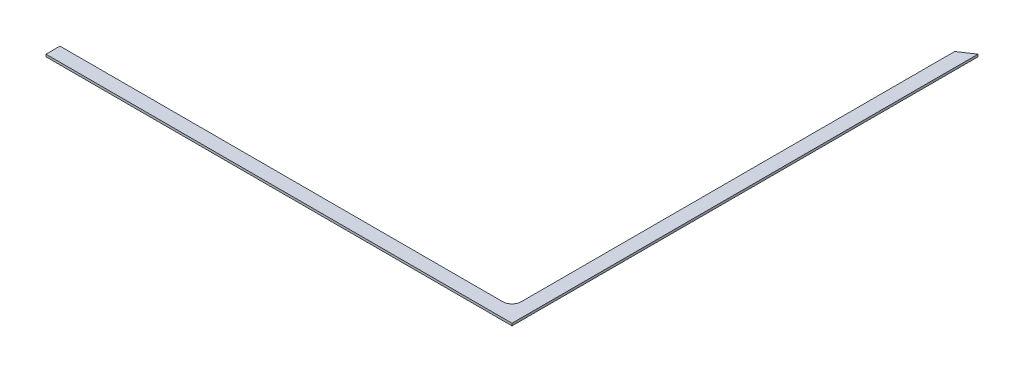
ISO-10303-21;
HEADER;
FILE_DESCRIPTION(('STEP AP214'),'2;1');
FILE_NAME('part.step','',(''),(''),'','','');
FILE_SCHEMA(('AUTOMOTIVE_DESIGN { 1 0 10303 214 1 1 1 1 }'));
ENDSEC;
DATA;
#1=APPLICATION_CONTEXT('core data for automotive mechanical design processes');
#2=APPLICATION_PROTOCOL_DEFINITION('international standard','automotive_design',2000,#1);
#3=PRODUCT_CONTEXT('',#1,'mechanical');
#4=PRODUCT('Part','Part','',(#3));
#5=PRODUCT_RELATED_PRODUCT_CATEGORY('part','',(#4));
#6=PRODUCT_DEFINITION_FORMATION('','',#4);
#7=PRODUCT_DEFINITION_CONTEXT('part definition',#1,'design');
#8=PRODUCT_DEFINITION('design','',#6,#7);
#9=PRODUCT_DEFINITION_SHAPE('','',#8);
#10=(LENGTH_UNIT() NAMED_UNIT(*) SI_UNIT(.MILLI.,.METRE.));
#11=(NAMED_UNIT(*) PLANE_ANGLE_UNIT() SI_UNIT($,.RADIAN.));
#12=(NAMED_UNIT(*) SI_UNIT($,.STERADIAN.) SOLID_ANGLE_UNIT());
#13=UNCERTAINTY_MEASURE_WITH_UNIT(LENGTH_MEASURE(1.E-05),#10,'distance_accuracy_value','');
#14=(GEOMETRIC_REPRESENTATION_CONTEXT(3) GLOBAL_UNCERTAINTY_ASSIGNED_CONTEXT((#13)) GLOBAL_UNIT_ASSIGNED_CONTEXT((#10,
#11,#12)) REPRESENTATION_CONTEXT('',''));
#15=CARTESIAN_POINT('',(0.,0.,0.));
#16=DIRECTION('',(0.,0.,1.));
#17=DIRECTION('',(1.,0.,0.));
#18=AXIS2_PLACEMENT_3D('',#15,#16,#17);
#19=CARTESIAN_POINT('',(-48.5,0.125,0.));
#20=DIRECTION('',(0.,0.,1.));
#21=DIRECTION('',(1.,0.,0.));
#22=AXIS2_PLACEMENT_3D('',#19,#20,#21);
#23=PLANE('',#22);
#24=DIRECTION('',(-1.,0.,0.));
#25=VECTOR('',#24,1.);
#26=CARTESIAN_POINT('',(-48.5,0.125,0.));
#27=LINE('',#26,#25);
#28=CARTESIAN_POINT('',(-1.00000000000001,0.125,0.));
#29=VERTEX_POINT('',#28);
#30=CARTESIAN_POINT('',(-48.5,0.125,0.));
#31=VERTEX_POINT('',#30);
#32=EDGE_CURVE('E97',#29,#31,#27,.T.);
#33=ORIENTED_EDGE('',*,*,#32,.F.);
#34=DIRECTION('',(0.,-1.,0.));
#35=VECTOR('',#34,1.);
#36=CARTESIAN_POINT('',(-1.,-0.125,0.));
#37=LINE('',#36,#35);
#38=CARTESIAN_POINT('',(-1.00000000000001,-0.125,0.));
#39=VERTEX_POINT('',#38);
#40=EDGE_CURVE('E123',#29,#39,#37,.T.);
#41=ORIENTED_EDGE('',*,*,#40,.T.);
#42=DIRECTION('',(-1.,0.,0.));
#43=VECTOR('',#42,1.);
#44=CARTESIAN_POINT('',(-48.5,-0.125,0.));
#45=LINE('',#44,#43);
#46=CARTESIAN_POINT('',(-48.5,-0.125,0.));
#47=VERTEX_POINT('',#46);
#48=EDGE_CURVE('E120',#39,#47,#45,.T.);
#49=ORIENTED_EDGE('',*,*,#48,.T.);
#50=DIRECTION('',(0.,-1.,0.));
#51=VECTOR('',#50,1.);
#52=CARTESIAN_POINT('',(-48.5,0.125,0.));
#53=LINE('',#52,#51);
#54=EDGE_CURVE('E113',#31,#47,#53,.T.);
#55=ORIENTED_EDGE('',*,*,#54,.F.);
#56=EDGE_LOOP('',(#33,#41,#49,#55));
#57=FACE_BOUND('',#56,.T.);
#58=ADVANCED_FACE('F38',(#57),#23,.F.);
#59=CARTESIAN_POINT('',(-48.5,0.125,1.5));
#60=DIRECTION('',(1.,0.,0.));
#61=DIRECTION('',(0.,0.,-1.));
#62=AXIS2_PLACEMENT_3D('',#59,#60,#61);
#63=PLANE('',#62);
#64=DIRECTION('',(0.,0.,1.));
#65=VECTOR('',#64,1.);
#66=CARTESIAN_POINT('',(-48.5,-0.125,1.5));
#67=LINE('',#66,#65);
#68=CARTESIAN_POINT('',(-48.5,-0.125,1.5));
#69=VERTEX_POINT('',#68);
#70=EDGE_CURVE('E157',#47,#69,#67,.T.);
#71=ORIENTED_EDGE('',*,*,#70,.T.);
#72=DIRECTION('',(0.,-1.,0.));
#73=VECTOR('',#72,1.);
#74=CARTESIAN_POINT('',(-48.5,0.125,1.5));
#75=LINE('',#74,#73);
#76=CARTESIAN_POINT('',(-48.5,0.125,1.5));
#77=VERTEX_POINT('',#76);
#78=EDGE_CURVE('E115',#77,#69,#75,.T.);
#79=ORIENTED_EDGE('',*,*,#78,.F.);
#80=DIRECTION('',(0.,0.,1.));
#81=VECTOR('',#80,1.);
#82=CARTESIAN_POINT('',(-48.5,0.125,1.5));
#83=LINE('',#82,#81);
#84=EDGE_CURVE('E100',#31,#77,#83,.T.);
#85=ORIENTED_EDGE('',*,*,#84,.F.);
#86=ORIENTED_EDGE('',*,*,#54,.T.);
#87=EDGE_LOOP('',(#71,#79,#85,#86));
#88=FACE_BOUND('',#87,.T.);
#89=ADVANCED_FACE('F112',(#88),#63,.F.);
#90=CARTESIAN_POINT('',(1.5,0.125,1.5));
#91=DIRECTION('',(0.,0.,-1.));
#92=DIRECTION('',(-1.,0.,0.));
#93=AXIS2_PLACEMENT_3D('',#90,#91,#92);
#94=PLANE('',#93);
#95=DIRECTION('',(1.,0.,0.));
#96=VECTOR('',#95,1.);
#97=CARTESIAN_POINT('',(1.5,-0.125,1.5));
#98=LINE('',#97,#96);
#99=CARTESIAN_POINT('',(1.5,-0.125,1.5));
#100=VERTEX_POINT('',#99);
#101=EDGE_CURVE('E154',#69,#100,#98,.T.);
#102=ORIENTED_EDGE('',*,*,#101,.T.);
#103=DIRECTION('',(0.,-1.,0.));
#104=VECTOR('',#103,1.);
#105=CARTESIAN_POINT('',(1.5,0.125,1.5));
#106=LINE('',#105,#104);
#107=CARTESIAN_POINT('',(1.5,0.125,1.5));
#108=VERTEX_POINT('',#107);
#109=EDGE_CURVE('E128',#108,#100,#106,.T.);
#110=ORIENTED_EDGE('',*,*,#109,.F.);
#111=DIRECTION('',(1.,0.,0.));
#112=VECTOR('',#111,1.);
#113=CARTESIAN_POINT('',(1.5,0.125,1.5));
#114=LINE('',#113,#112);
#115=EDGE_CURVE('E118',#77,#108,#114,.T.);
#116=ORIENTED_EDGE('',*,*,#115,.F.);
#117=ORIENTED_EDGE('',*,*,#78,.T.);
#118=EDGE_LOOP('',(#102,#110,#116,#117));
#119=FACE_BOUND('',#118,.T.);
#120=ADVANCED_FACE('F175',(#119),#94,.F.);
#121=CARTESIAN_POINT('',(1.5,0.125,-48.5));
#122=DIRECTION('',(-1.,0.,0.));
#123=DIRECTION('',(0.,0.,1.));
#124=AXIS2_PLACEMENT_3D('',#121,#122,#123);
#125=PLANE('',#124);
#126=DIRECTION('',(0.,0.,-1.));
#127=VECTOR('',#126,1.);
#128=CARTESIAN_POINT('',(1.5,-0.125,-48.5));
#129=LINE('',#128,#127);
#130=CARTESIAN_POINT('',(1.5,-0.125,-48.5));
#131=VERTEX_POINT('',#130);
#132=EDGE_CURVE('E151',#100,#131,#129,.T.);
#133=ORIENTED_EDGE('',*,*,#132,.T.);
#134=DIRECTION('',(0.,-1.,0.));
#135=VECTOR('',#134,1.);
#136=CARTESIAN_POINT('',(1.5,0.125,-48.5));
#137=LINE('',#136,#135);
#138=CARTESIAN_POINT('',(1.5,0.125,-48.5));
#139=VERTEX_POINT('',#138);
#140=EDGE_CURVE('E137',#139,#131,#137,.T.);
#141=ORIENTED_EDGE('',*,*,#140,.F.);
#142=DIRECTION('',(0.,0.,-1.));
#143=VECTOR('',#142,1.);
#144=CARTESIAN_POINT('',(1.5,0.125,-48.5));
#145=LINE('',#144,#143);
#146=EDGE_CURVE('E167',#108,#139,#145,.T.);
#147=ORIENTED_EDGE('',*,*,#146,.F.);
#148=ORIENTED_EDGE('',*,*,#109,.T.);
#149=EDGE_LOOP('',(#133,#141,#147,#148));
#150=FACE_BOUND('',#149,.T.);
#151=ADVANCED_FACE('F179',(#150),#125,.F.);
#152=CARTESIAN_POINT('',(0.,0.125,-47.5));
#153=DIRECTION('',(0.554700196225231,0.,0.832050294337843));
#154=DIRECTION('',(0.832050294337843,0.,-0.554700196225231));
#155=AXIS2_PLACEMENT_3D('',#152,#153,#154);
#156=PLANE('',#155);
#157=DIRECTION('',(-0.832050294337843,0.,0.554700196225231));
#158=VECTOR('',#157,1.);
#159=CARTESIAN_POINT('',(0.,-0.125,-47.5));
#160=LINE('',#159,#158);
#161=CARTESIAN_POINT('',(0.,-0.125,-47.5));
#162=VERTEX_POINT('',#161);
#163=EDGE_CURVE('E148',#131,#162,#160,.T.);
#164=ORIENTED_EDGE('',*,*,#163,.T.);
#165=DIRECTION('',(0.,-1.,0.));
#166=VECTOR('',#165,1.);
#167=CARTESIAN_POINT('',(0.,0.125,-47.5));
#168=LINE('',#167,#166);
#169=CARTESIAN_POINT('',(0.,0.125,-47.5));
#170=VERTEX_POINT('',#169);
#171=EDGE_CURVE('E141',#170,#162,#168,.T.);
#172=ORIENTED_EDGE('',*,*,#171,.F.);
#173=DIRECTION('',(-0.832050294337843,0.,0.554700196225231));
#174=VECTOR('',#173,1.);
#175=CARTESIAN_POINT('',(0.,0.125,-47.5));
#176=LINE('',#175,#174);
#177=EDGE_CURVE('E164',#139,#170,#176,.T.);
#178=ORIENTED_EDGE('',*,*,#177,.F.);
#179=ORIENTED_EDGE('',*,*,#140,.T.);
#180=EDGE_LOOP('',(#164,#172,#178,#179));
#181=FACE_BOUND('',#180,.T.);
#182=ADVANCED_FACE('F184',(#181),#156,.F.);
#183=CARTESIAN_POINT('',(0.,0.125,0.));
#184=DIRECTION('',(1.,0.,0.));
#185=DIRECTION('',(0.,0.,-1.));
#186=AXIS2_PLACEMENT_3D('',#183,#184,#185);
#187=PLANE('',#186);
#188=DIRECTION('',(0.,0.,1.));
#189=VECTOR('',#188,1.);
#190=CARTESIAN_POINT('',(0.,-0.125,0.));
#191=LINE('',#190,#189);
#192=CARTESIAN_POINT('',(0.,-0.125,-1.));
#193=VERTEX_POINT('',#192);
#194=EDGE_CURVE('E108',#162,#193,#191,.T.);
#195=ORIENTED_EDGE('',*,*,#194,.T.);
#196=DIRECTION('',(0.,-1.,0.));
#197=VECTOR('',#196,1.);
#198=CARTESIAN_POINT('',(0.,0.125,-1.));
#199=LINE('',#198,#197);
#200=CARTESIAN_POINT('',(0.,0.125,-1.));
#201=VERTEX_POINT('',#200);
#202=EDGE_CURVE('E54',#193,#201,#199,.F.);
#203=ORIENTED_EDGE('',*,*,#202,.T.);
#204=DIRECTION('',(0.,0.,1.));
#205=VECTOR('',#204,1.);
#206=CARTESIAN_POINT('',(0.,0.125,0.));
#207=LINE('',#206,#205);
#208=EDGE_CURVE('E145',#170,#201,#207,.T.);
#209=ORIENTED_EDGE('',*,*,#208,.F.);
#210=ORIENTED_EDGE('',*,*,#171,.T.);
#211=EDGE_LOOP('',(#195,#203,#209,#210));
#212=FACE_BOUND('',#211,.T.);
#213=ADVANCED_FACE('F187',(#212),#187,.F.);
#214=CARTESIAN_POINT('',(0.,0.125,0.));
#215=DIRECTION('',(0.,1.,0.));
#216=DIRECTION('',(0.,0.,1.));
#217=AXIS2_PLACEMENT_3D('',#214,#215,#216);
#218=PLANE('',#217);
#219=ORIENTED_EDGE('',*,*,#208,.T.);
#220=CARTESIAN_POINT('',(-1.,0.125,-1.));
#221=DIRECTION('',(0.,1.,0.));
#222=DIRECTION('',(0.,0.,1.));
#223=AXIS2_PLACEMENT_3D('',#220,#221,#222);
#224=CIRCLE('',#223,1.);
#225=EDGE_CURVE('E11',#201,#29,#224,.F.);
#226=ORIENTED_EDGE('',*,*,#225,.T.);
#227=ORIENTED_EDGE('',*,*,#32,.T.);
#228=ORIENTED_EDGE('',*,*,#84,.T.);
#229=ORIENTED_EDGE('',*,*,#115,.T.);
#230=ORIENTED_EDGE('',*,*,#146,.T.);
#231=ORIENTED_EDGE('',*,*,#177,.T.);
#232=EDGE_LOOP('',(#219,#226,#227,#228,#229,#230,#231));
#233=FACE_BOUND('',#232,.T.);
#234=ADVANCED_FACE('F99',(#233),#218,.T.);
#235=CARTESIAN_POINT('',(0.,-0.125,0.));
#236=DIRECTION('',(0.,1.,0.));
#237=DIRECTION('',(0.,0.,1.));
#238=AXIS2_PLACEMENT_3D('',#235,#236,#237);
#239=PLANE('',#238);
#240=ORIENTED_EDGE('',*,*,#48,.F.);
#241=CARTESIAN_POINT('',(-1.,-0.125,-1.));
#242=DIRECTION('',(0.,1.,0.));
#243=DIRECTION('',(0.,0.,1.));
#244=AXIS2_PLACEMENT_3D('',#241,#242,#243);
#245=CIRCLE('',#244,1.);
#246=EDGE_CURVE('E47',#39,#193,#245,.T.);
#247=ORIENTED_EDGE('',*,*,#246,.T.);
#248=ORIENTED_EDGE('',*,*,#194,.F.);
#249=ORIENTED_EDGE('',*,*,#163,.F.);
#250=ORIENTED_EDGE('',*,*,#132,.F.);
#251=ORIENTED_EDGE('',*,*,#101,.F.);
#252=ORIENTED_EDGE('',*,*,#70,.F.);
#253=EDGE_LOOP('',(#240,#247,#248,#249,#250,#251,#252));
#254=FACE_BOUND('',#253,.T.);
#255=ADVANCED_FACE('F186',(#254),#239,.F.);
#256=CARTESIAN_POINT('',(-1.,0.125,-1.));
#257=DIRECTION('',(0.,1.,0.));
#258=DIRECTION('',(0.,0.,1.));
#259=AXIS2_PLACEMENT_3D('',#256,#257,#258);
#260=CYLINDRICAL_SURFACE('',#259,1.);
#261=ORIENTED_EDGE('',*,*,#225,.F.);
#262=ORIENTED_EDGE('',*,*,#202,.F.);
#263=ORIENTED_EDGE('',*,*,#246,.F.);
#264=ORIENTED_EDGE('',*,*,#40,.F.);
#265=EDGE_LOOP('',(#261,#262,#263,#264));
#266=FACE_BOUND('',#265,.T.);
#267=ADVANCED_FACE('F40',(#266),#260,.F.);
#268=CLOSED_SHELL('',(#58,#89,#120,#151,#182,#213,#234,#255,#267));
#269=MANIFOLD_SOLID_BREP('B2',#268);
#270=ADVANCED_BREP_SHAPE_REPRESENTATION('',(#18,#269),#14);
#271=SHAPE_DEFINITION_REPRESENTATION(#9,#270);
ENDSEC;
END-ISO-10303-21;
